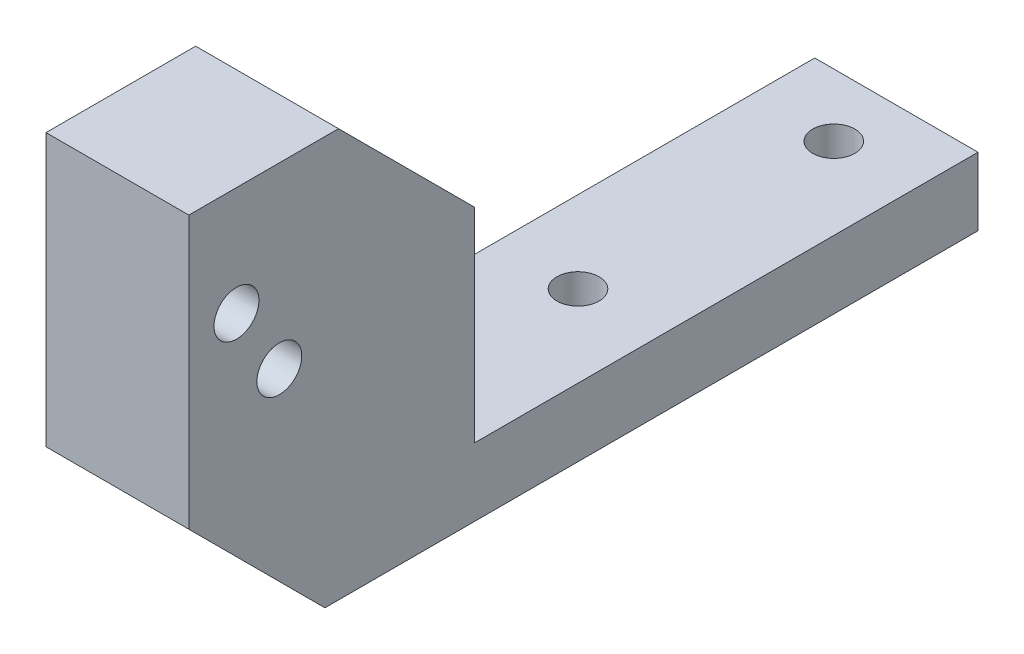
ISO-10303-21;
HEADER;
FILE_DESCRIPTION(('STEP AP214'),'2;1');
FILE_NAME('part.step','',(''),(''),'','','');
FILE_SCHEMA(('AUTOMOTIVE_DESIGN { 1 0 10303 214 1 1 1 1 }'));
ENDSEC;
DATA;
#1=APPLICATION_CONTEXT('core data for automotive mechanical design processes');
#2=APPLICATION_PROTOCOL_DEFINITION('international standard','automotive_design',2000,#1);
#3=PRODUCT_CONTEXT('',#1,'mechanical');
#4=PRODUCT('Part','Part','',(#3));
#5=PRODUCT_RELATED_PRODUCT_CATEGORY('part','',(#4));
#6=PRODUCT_DEFINITION_FORMATION('','',#4);
#7=PRODUCT_DEFINITION_CONTEXT('part definition',#1,'design');
#8=PRODUCT_DEFINITION('design','',#6,#7);
#9=PRODUCT_DEFINITION_SHAPE('','',#8);
#10=(LENGTH_UNIT() NAMED_UNIT(*) SI_UNIT(.MILLI.,.METRE.));
#11=(NAMED_UNIT(*) PLANE_ANGLE_UNIT() SI_UNIT($,.RADIAN.));
#12=(NAMED_UNIT(*) SI_UNIT($,.STERADIAN.) SOLID_ANGLE_UNIT());
#13=UNCERTAINTY_MEASURE_WITH_UNIT(LENGTH_MEASURE(1.E-05),#10,'distance_accuracy_value','');
#14=(GEOMETRIC_REPRESENTATION_CONTEXT(3) GLOBAL_UNCERTAINTY_ASSIGNED_CONTEXT((#13)) GLOBAL_UNIT_ASSIGNED_CONTEXT((#10,
#11,#12)) REPRESENTATION_CONTEXT('',''));
#15=CARTESIAN_POINT('',(0.,0.,0.));
#16=DIRECTION('',(0.,0.,1.));
#17=DIRECTION('',(1.,0.,0.));
#18=AXIS2_PLACEMENT_3D('',#15,#16,#17);
#19=CARTESIAN_POINT('',(0.,2.5,0.));
#20=DIRECTION('',(0.,-1.,0.));
#21=DIRECTION('',(0.,0.,-1.));
#22=AXIS2_PLACEMENT_3D('',#19,#20,#21);
#23=PLANE('',#22);
#24=CARTESIAN_POINT('',(0.,2.5,9.4));
#25=DIRECTION('',(0.,1.,0.));
#26=DIRECTION('',(0.,0.,-1.));
#27=AXIS2_PLACEMENT_3D('',#24,#25,#26);
#28=CIRCLE('',#27,1.55);
#29=CARTESIAN_POINT('',(0.,2.5,7.85));
#30=VERTEX_POINT('',#29);
#31=EDGE_CURVE('E168',#30,#30,#28,.T.);
#32=ORIENTED_EDGE('',*,*,#31,.F.);
#33=EDGE_LOOP('',(#32));
#34=FACE_BOUND('',#33,.T.);
#35=CARTESIAN_POINT('',(0.,2.5,-9.4));
#36=DIRECTION('',(0.,1.,0.));
#37=DIRECTION('',(0.,0.,1.));
#38=AXIS2_PLACEMENT_3D('',#35,#36,#37);
#39=CIRCLE('',#38,1.55);
#40=CARTESIAN_POINT('',(0.,2.5,-7.85));
#41=VERTEX_POINT('',#40);
#42=EDGE_CURVE('E176',#41,#41,#39,.T.);
#43=ORIENTED_EDGE('',*,*,#42,.F.);
#44=EDGE_LOOP('',(#43));
#45=FACE_BOUND('',#44,.T.);
#46=DIRECTION('',(0.,0.,1.));
#47=VECTOR('',#46,1.);
#48=CARTESIAN_POINT('',(-6.,2.5,14.));
#49=LINE('',#48,#47);
#50=CARTESIAN_POINT('',(-6.,2.5,-14.));
#51=VERTEX_POINT('',#50);
#52=CARTESIAN_POINT('',(-6.,2.5,39.));
#53=VERTEX_POINT('',#52);
#54=EDGE_CURVE('E191',#51,#53,#49,.T.);
#55=ORIENTED_EDGE('',*,*,#54,.T.);
#56=DIRECTION('',(-1.,0.,0.));
#57=VECTOR('',#56,1.);
#58=CARTESIAN_POINT('',(0.,2.5,39.));
#59=LINE('',#58,#57);
#60=CARTESIAN_POINT('',(-4.5,2.5,39.));
#61=VERTEX_POINT('',#60);
#62=EDGE_CURVE('E57',#53,#61,#59,.F.);
#63=ORIENTED_EDGE('',*,*,#62,.T.);
#64=DIRECTION('',(0.,0.,1.));
#65=VECTOR('',#64,1.);
#66=CARTESIAN_POINT('',(-4.5,2.5,44.));
#67=LINE('',#66,#65);
#68=CARTESIAN_POINT('',(-4.5,2.5,23.));
#69=VERTEX_POINT('',#68);
#70=EDGE_CURVE('E156',#69,#61,#67,.T.);
#71=ORIENTED_EDGE('',*,*,#70,.F.);
#72=DIRECTION('',(-1.,0.,0.));
#73=VECTOR('',#72,1.);
#74=CARTESIAN_POINT('',(6.,2.5,23.));
#75=LINE('',#74,#73);
#76=CARTESIAN_POINT('',(6.,2.5,23.));
#77=VERTEX_POINT('',#76);
#78=EDGE_CURVE('E152',#77,#69,#75,.T.);
#79=ORIENTED_EDGE('',*,*,#78,.F.);
#80=DIRECTION('',(0.,0.,-1.));
#81=VECTOR('',#80,1.);
#82=CARTESIAN_POINT('',(6.,2.5,14.));
#83=LINE('',#82,#81);
#84=CARTESIAN_POINT('',(6.,2.5,-14.));
#85=VERTEX_POINT('',#84);
#86=EDGE_CURVE('E184',#77,#85,#83,.T.);
#87=ORIENTED_EDGE('',*,*,#86,.T.);
#88=DIRECTION('',(-1.,0.,0.));
#89=VECTOR('',#88,1.);
#90=CARTESIAN_POINT('',(-6.,2.5,-14.));
#91=LINE('',#90,#89);
#92=EDGE_CURVE('E187',#85,#51,#91,.T.);
#93=ORIENTED_EDGE('',*,*,#92,.T.);
#94=EDGE_LOOP('',(#55,#63,#71,#79,#87,#93));
#95=FACE_BOUND('',#94,.T.);
#96=ADVANCED_FACE('F47',(#34,#45,#95),#23,.F.);
#97=CARTESIAN_POINT('',(0.,-2.5,0.));
#98=DIRECTION('',(0.,-1.,0.));
#99=DIRECTION('',(0.,0.,-1.));
#100=AXIS2_PLACEMENT_3D('',#97,#98,#99);
#101=PLANE('',#100);
#102=CARTESIAN_POINT('',(0.,-2.5,-9.4));
#103=DIRECTION('',(0.,1.,0.));
#104=DIRECTION('',(0.,0.,1.));
#105=AXIS2_PLACEMENT_3D('',#102,#103,#104);
#106=CIRCLE('',#105,1.55);
#107=CARTESIAN_POINT('',(0.,-2.5,-7.85));
#108=VERTEX_POINT('',#107);
#109=EDGE_CURVE('E172',#108,#108,#106,.T.);
#110=ORIENTED_EDGE('',*,*,#109,.T.);
#111=EDGE_LOOP('',(#110));
#112=FACE_BOUND('',#111,.T.);
#113=DIRECTION('',(0.,0.,-1.));
#114=VECTOR('',#113,1.);
#115=CARTESIAN_POINT('',(6.,-2.5,14.));
#116=LINE('',#115,#114);
#117=CARTESIAN_POINT('',(6.,-2.5,34.));
#118=VERTEX_POINT('',#117);
#119=CARTESIAN_POINT('',(6.,-2.5,-14.));
#120=VERTEX_POINT('',#119);
#121=EDGE_CURVE('E180',#118,#120,#116,.T.);
#122=ORIENTED_EDGE('',*,*,#121,.F.);
#123=DIRECTION('',(-1.,0.,0.));
#124=VECTOR('',#123,1.);
#125=CARTESIAN_POINT('',(0.,-2.5,34.));
#126=LINE('',#125,#124);
#127=CARTESIAN_POINT('',(-6.,-2.5,34.));
#128=VERTEX_POINT('',#127);
#129=EDGE_CURVE('E226',#118,#128,#126,.T.);
#130=ORIENTED_EDGE('',*,*,#129,.T.);
#131=DIRECTION('',(0.,0.,1.));
#132=VECTOR('',#131,1.);
#133=CARTESIAN_POINT('',(-6.,-2.5,14.));
#134=LINE('',#133,#132);
#135=CARTESIAN_POINT('',(-6.,-2.5,-14.));
#136=VERTEX_POINT('',#135);
#137=EDGE_CURVE('E188',#136,#128,#134,.T.);
#138=ORIENTED_EDGE('',*,*,#137,.F.);
#139=DIRECTION('',(-1.,0.,0.));
#140=VECTOR('',#139,1.);
#141=CARTESIAN_POINT('',(-6.,-2.5,-14.));
#142=LINE('',#141,#140);
#143=EDGE_CURVE('E197',#120,#136,#142,.T.);
#144=ORIENTED_EDGE('',*,*,#143,.F.);
#145=EDGE_LOOP('',(#122,#130,#138,#144));
#146=FACE_BOUND('',#145,.T.);
#147=CARTESIAN_POINT('',(0.,-2.5,9.4));
#148=DIRECTION('',(0.,1.,0.));
#149=DIRECTION('',(0.,0.,-1.));
#150=AXIS2_PLACEMENT_3D('',#147,#148,#149);
#151=CIRCLE('',#150,1.55);
#152=CARTESIAN_POINT('',(0.,-2.5,7.85));
#153=VERTEX_POINT('',#152);
#154=EDGE_CURVE('E167',#153,#153,#151,.T.);
#155=ORIENTED_EDGE('',*,*,#154,.T.);
#156=EDGE_LOOP('',(#155));
#157=FACE_BOUND('',#156,.T.);
#158=ADVANCED_FACE('F235',(#112,#146,#157),#101,.T.);
#159=CARTESIAN_POINT('',(6.,2.5,14.));
#160=DIRECTION('',(-1.,0.,0.));
#161=DIRECTION('',(0.,0.,1.));
#162=AXIS2_PLACEMENT_3D('',#159,#160,#161);
#163=PLANE('',#162);
#164=CARTESIAN_POINT('',(6.,19.5,40.5));
#165=DIRECTION('',(-1.,0.,0.));
#166=DIRECTION('',(0.,0.,1.));
#167=AXIS2_PLACEMENT_3D('',#164,#165,#166);
#168=CIRCLE('',#167,1.65);
#169=CARTESIAN_POINT('',(6.,19.5,42.15));
#170=VERTEX_POINT('',#169);
#171=EDGE_CURVE('E157',#170,#170,#168,.T.);
#172=ORIENTED_EDGE('',*,*,#171,.T.);
#173=EDGE_LOOP('',(#172));
#174=FACE_BOUND('',#173,.T.);
#175=CARTESIAN_POINT('',(6.,14.3933866408352,37.35));
#176=DIRECTION('',(-1.,0.,0.));
#177=DIRECTION('',(0.,0.,1.));
#178=AXIS2_PLACEMENT_3D('',#175,#176,#177);
#179=CIRCLE('',#178,1.65);
#180=CARTESIAN_POINT('',(6.,14.3933866408352,39.));
#181=VERTEX_POINT('',#180);
#182=EDGE_CURVE('E250',#181,#181,#179,.T.);
#183=ORIENTED_EDGE('',*,*,#182,.T.);
#184=EDGE_LOOP('',(#183));
#185=FACE_BOUND('',#184,.T.);
#186=DIRECTION('',(0.,1.,0.));
#187=VECTOR('',#186,1.);
#188=CARTESIAN_POINT('',(6.,2.5,44.));
#189=LINE('',#188,#187);
#190=CARTESIAN_POINT('',(6.,7.5,44.));
#191=VERTEX_POINT('',#190);
#192=CARTESIAN_POINT('',(6.,27.5,44.));
#193=VERTEX_POINT('',#192);
#194=EDGE_CURVE('E147',#191,#193,#189,.T.);
#195=ORIENTED_EDGE('',*,*,#194,.F.);
#196=DIRECTION('',(0.,0.707106781186547,0.707106781186548));
#197=VECTOR('',#196,1.);
#198=CARTESIAN_POINT('',(6.,7.5,44.));
#199=LINE('',#198,#197);
#200=EDGE_CURVE('E223',#191,#118,#199,.F.);
#201=ORIENTED_EDGE('',*,*,#200,.T.);
#202=ORIENTED_EDGE('',*,*,#121,.T.);
#203=DIRECTION('',(0.,-1.,0.));
#204=VECTOR('',#203,1.);
#205=CARTESIAN_POINT('',(6.,2.5,-14.));
#206=LINE('',#205,#204);
#207=EDGE_CURVE('E205',#85,#120,#206,.T.);
#208=ORIENTED_EDGE('',*,*,#207,.F.);
#209=ORIENTED_EDGE('',*,*,#86,.F.);
#210=DIRECTION('',(0.,-1.,0.));
#211=VECTOR('',#210,1.);
#212=CARTESIAN_POINT('',(6.,27.5,23.));
#213=LINE('',#212,#211);
#214=CARTESIAN_POINT('',(6.,17.5,23.));
#215=VERTEX_POINT('',#214);
#216=EDGE_CURVE('E162',#215,#77,#213,.T.);
#217=ORIENTED_EDGE('',*,*,#216,.F.);
#218=DIRECTION('',(0.,0.707106781186549,0.707106781186546));
#219=VECTOR('',#218,1.);
#220=CARTESIAN_POINT('',(6.,27.5,33.));
#221=LINE('',#220,#219);
#222=CARTESIAN_POINT('',(6.,27.5,33.));
#223=VERTEX_POINT('',#222);
#224=EDGE_CURVE('E217',#215,#223,#221,.T.);
#225=ORIENTED_EDGE('',*,*,#224,.T.);
#226=DIRECTION('',(0.,0.,-1.));
#227=VECTOR('',#226,1.);
#228=CARTESIAN_POINT('',(6.,27.5,44.));
#229=LINE('',#228,#227);
#230=EDGE_CURVE('E133',#193,#223,#229,.T.);
#231=ORIENTED_EDGE('',*,*,#230,.F.);
#232=EDGE_LOOP('',(#195,#201,#202,#208,#209,#217,#225,#231));
#233=FACE_BOUND('',#232,.T.);
#234=ADVANCED_FACE('F242',(#174,#185,#233),#163,.F.);
#235=CARTESIAN_POINT('',(-6.,2.5,-14.));
#236=DIRECTION('',(0.,0.,1.));
#237=DIRECTION('',(1.,0.,0.));
#238=AXIS2_PLACEMENT_3D('',#235,#236,#237);
#239=PLANE('',#238);
#240=ORIENTED_EDGE('',*,*,#143,.T.);
#241=DIRECTION('',(0.,-1.,0.));
#242=VECTOR('',#241,1.);
#243=CARTESIAN_POINT('',(-6.,2.5,-14.));
#244=LINE('',#243,#242);
#245=EDGE_CURVE('E194',#51,#136,#244,.T.);
#246=ORIENTED_EDGE('',*,*,#245,.F.);
#247=ORIENTED_EDGE('',*,*,#92,.F.);
#248=ORIENTED_EDGE('',*,*,#207,.T.);
#249=EDGE_LOOP('',(#240,#246,#247,#248));
#250=FACE_BOUND('',#249,.T.);
#251=ADVANCED_FACE('F280',(#250),#239,.F.);
#252=CARTESIAN_POINT('',(-6.,2.5,14.));
#253=DIRECTION('',(1.,0.,0.));
#254=DIRECTION('',(0.,0.,-1.));
#255=AXIS2_PLACEMENT_3D('',#252,#253,#254);
#256=PLANE('',#255);
#257=ORIENTED_EDGE('',*,*,#137,.T.);
#258=DIRECTION('',(0.,-0.707106781186547,-0.707106781186548));
#259=VECTOR('',#258,1.);
#260=CARTESIAN_POINT('',(-6.,7.5,44.));
#261=LINE('',#260,#259);
#262=EDGE_CURVE('E71',#128,#53,#261,.F.);
#263=ORIENTED_EDGE('',*,*,#262,.T.);
#264=ORIENTED_EDGE('',*,*,#54,.F.);
#265=ORIENTED_EDGE('',*,*,#245,.T.);
#266=EDGE_LOOP('',(#257,#263,#264,#265));
#267=FACE_BOUND('',#266,.T.);
#268=ADVANCED_FACE('F239',(#267),#256,.F.);
#269=CARTESIAN_POINT('',(0.,2.5,-9.4));
#270=DIRECTION('',(0.,-1.,0.));
#271=DIRECTION('',(0.,0.,-1.));
#272=AXIS2_PLACEMENT_3D('',#269,#270,#271);
#273=CYLINDRICAL_SURFACE('',#272,1.55);
#274=ORIENTED_EDGE('',*,*,#42,.T.);
#275=EDGE_LOOP('',(#274));
#276=FACE_BOUND('',#275,.T.);
#277=ORIENTED_EDGE('',*,*,#109,.F.);
#278=EDGE_LOOP('',(#277));
#279=FACE_BOUND('',#278,.T.);
#280=ADVANCED_FACE('F301',(#276,#279),#273,.F.);
#281=CARTESIAN_POINT('',(0.,2.5,9.4));
#282=DIRECTION('',(0.,-1.,0.));
#283=DIRECTION('',(0.,0.,-1.));
#284=AXIS2_PLACEMENT_3D('',#281,#282,#283);
#285=CYLINDRICAL_SURFACE('',#284,1.55);
#286=ORIENTED_EDGE('',*,*,#31,.T.);
#287=EDGE_LOOP('',(#286));
#288=FACE_BOUND('',#287,.T.);
#289=ORIENTED_EDGE('',*,*,#154,.F.);
#290=EDGE_LOOP('',(#289));
#291=FACE_BOUND('',#290,.T.);
#292=ADVANCED_FACE('F308',(#288,#291),#285,.F.);
#293=CARTESIAN_POINT('',(0.,0.,44.));
#294=DIRECTION('',(0.,0.,1.));
#295=DIRECTION('',(1.,0.,0.));
#296=AXIS2_PLACEMENT_3D('',#293,#294,#295);
#297=PLANE('',#296);
#298=DIRECTION('',(0.,-1.,0.));
#299=VECTOR('',#298,1.);
#300=CARTESIAN_POINT('',(-4.5,27.5,44.));
#301=LINE('',#300,#299);
#302=CARTESIAN_POINT('',(-4.5,27.5,44.));
#303=VERTEX_POINT('',#302);
#304=CARTESIAN_POINT('',(-4.5,7.5,44.));
#305=VERTEX_POINT('',#304);
#306=EDGE_CURVE('E136',#303,#305,#301,.T.);
#307=ORIENTED_EDGE('',*,*,#306,.T.);
#308=DIRECTION('',(1.,0.,0.));
#309=VECTOR('',#308,1.);
#310=CARTESIAN_POINT('',(0.,7.5,44.));
#311=LINE('',#310,#309);
#312=EDGE_CURVE('E220',#305,#191,#311,.T.);
#313=ORIENTED_EDGE('',*,*,#312,.T.);
#314=ORIENTED_EDGE('',*,*,#194,.T.);
#315=DIRECTION('',(1.,0.,0.));
#316=VECTOR('',#315,1.);
#317=CARTESIAN_POINT('',(6.,27.5,44.));
#318=LINE('',#317,#316);
#319=EDGE_CURVE('E127',#303,#193,#318,.T.);
#320=ORIENTED_EDGE('',*,*,#319,.F.);
#321=EDGE_LOOP('',(#307,#313,#314,#320));
#322=FACE_BOUND('',#321,.T.);
#323=ADVANCED_FACE('F145',(#322),#297,.T.);
#324=CARTESIAN_POINT('',(6.,27.5,23.));
#325=DIRECTION('',(0.,0.,1.));
#326=DIRECTION('',(1.,0.,0.));
#327=AXIS2_PLACEMENT_3D('',#324,#325,#326);
#328=PLANE('',#327);
#329=DIRECTION('',(0.,-1.,0.));
#330=VECTOR('',#329,1.);
#331=CARTESIAN_POINT('',(-4.5,27.5,23.));
#332=LINE('',#331,#330);
#333=CARTESIAN_POINT('',(-4.5,17.5,23.));
#334=VERTEX_POINT('',#333);
#335=EDGE_CURVE('E143',#334,#69,#332,.T.);
#336=ORIENTED_EDGE('',*,*,#335,.F.);
#337=DIRECTION('',(1.,0.,0.));
#338=VECTOR('',#337,1.);
#339=CARTESIAN_POINT('',(6.,17.5,23.));
#340=LINE('',#339,#338);
#341=EDGE_CURVE('E214',#334,#215,#340,.T.);
#342=ORIENTED_EDGE('',*,*,#341,.T.);
#343=ORIENTED_EDGE('',*,*,#216,.T.);
#344=ORIENTED_EDGE('',*,*,#78,.T.);
#345=EDGE_LOOP('',(#336,#342,#343,#344));
#346=FACE_BOUND('',#345,.T.);
#347=ADVANCED_FACE('F268',(#346),#328,.F.);
#348=CARTESIAN_POINT('',(-4.5,27.5,44.));
#349=DIRECTION('',(1.,0.,0.));
#350=DIRECTION('',(0.,0.,-1.));
#351=AXIS2_PLACEMENT_3D('',#348,#349,#350);
#352=PLANE('',#351);
#353=CARTESIAN_POINT('',(-4.5,19.5,40.5));
#354=DIRECTION('',(-1.,0.,0.));
#355=DIRECTION('',(0.,0.,1.));
#356=AXIS2_PLACEMENT_3D('',#353,#354,#355);
#357=CIRCLE('',#356,1.65);
#358=CARTESIAN_POINT('',(-4.5,19.5,42.15));
#359=VERTEX_POINT('',#358);
#360=EDGE_CURVE('E254',#359,#359,#357,.T.);
#361=ORIENTED_EDGE('',*,*,#360,.F.);
#362=EDGE_LOOP('',(#361));
#363=FACE_BOUND('',#362,.T.);
#364=CARTESIAN_POINT('',(-4.5,14.3933866408352,37.35));
#365=DIRECTION('',(-1.,0.,0.));
#366=DIRECTION('',(0.,0.,1.));
#367=AXIS2_PLACEMENT_3D('',#364,#365,#366);
#368=CIRCLE('',#367,1.65);
#369=CARTESIAN_POINT('',(-4.5,14.3933866408352,39.));
#370=VERTEX_POINT('',#369);
#371=EDGE_CURVE('E255',#370,#370,#368,.T.);
#372=ORIENTED_EDGE('',*,*,#371,.F.);
#373=EDGE_LOOP('',(#372));
#374=FACE_BOUND('',#373,.T.);
#375=ORIENTED_EDGE('',*,*,#70,.T.);
#376=DIRECTION('',(0.,-0.707106781186547,-0.707106781186548));
#377=VECTOR('',#376,1.);
#378=CARTESIAN_POINT('',(-4.5,7.5,44.));
#379=LINE('',#378,#377);
#380=EDGE_CURVE('E11',#61,#305,#379,.F.);
#381=ORIENTED_EDGE('',*,*,#380,.T.);
#382=ORIENTED_EDGE('',*,*,#306,.F.);
#383=DIRECTION('',(0.,0.,1.));
#384=VECTOR('',#383,1.);
#385=CARTESIAN_POINT('',(-4.5,27.5,44.));
#386=LINE('',#385,#384);
#387=CARTESIAN_POINT('',(-4.5,27.5,33.));
#388=VERTEX_POINT('',#387);
#389=EDGE_CURVE('E122',#388,#303,#386,.T.);
#390=ORIENTED_EDGE('',*,*,#389,.F.);
#391=DIRECTION('',(0.,-0.707106781186549,-0.707106781186546));
#392=VECTOR('',#391,1.);
#393=CARTESIAN_POINT('',(-4.5,27.5,33.));
#394=LINE('',#393,#392);
#395=EDGE_CURVE('E211',#388,#334,#394,.T.);
#396=ORIENTED_EDGE('',*,*,#395,.T.);
#397=ORIENTED_EDGE('',*,*,#335,.T.);
#398=EDGE_LOOP('',(#375,#381,#382,#390,#396,#397));
#399=FACE_BOUND('',#398,.T.);
#400=ADVANCED_FACE('F137',(#363,#374,#399),#352,.F.);
#401=CARTESIAN_POINT('',(0.,27.5,0.));
#402=DIRECTION('',(0.,1.,0.));
#403=DIRECTION('',(0.,0.,1.));
#404=AXIS2_PLACEMENT_3D('',#401,#402,#403);
#405=PLANE('',#404);
#406=ORIENTED_EDGE('',*,*,#230,.T.);
#407=DIRECTION('',(-1.,0.,0.));
#408=VECTOR('',#407,1.);
#409=CARTESIAN_POINT('',(-4.5,27.5,33.));
#410=LINE('',#409,#408);
#411=EDGE_CURVE('E130',#223,#388,#410,.T.);
#412=ORIENTED_EDGE('',*,*,#411,.T.);
#413=ORIENTED_EDGE('',*,*,#389,.T.);
#414=ORIENTED_EDGE('',*,*,#319,.T.);
#415=EDGE_LOOP('',(#406,#412,#413,#414));
#416=FACE_BOUND('',#415,.T.);
#417=ADVANCED_FACE('F125',(#416),#405,.T.);
#418=CARTESIAN_POINT('',(0.,27.5,33.));
#419=DIRECTION('',(0.,0.707106781186546,-0.707106781186549));
#420=DIRECTION('',(1.,0.,0.));
#421=AXIS2_PLACEMENT_3D('',#418,#419,#420);
#422=PLANE('',#421);
#423=ORIENTED_EDGE('',*,*,#224,.F.);
#424=ORIENTED_EDGE('',*,*,#341,.F.);
#425=ORIENTED_EDGE('',*,*,#395,.F.);
#426=ORIENTED_EDGE('',*,*,#411,.F.);
#427=EDGE_LOOP('',(#423,#424,#425,#426));
#428=FACE_BOUND('',#427,.T.);
#429=ADVANCED_FACE('F275',(#428),#422,.T.);
#430=CARTESIAN_POINT('',(20.5,14.3933866408352,37.35));
#431=DIRECTION('',(-1.,0.,0.));
#432=DIRECTION('',(0.,0.,1.));
#433=AXIS2_PLACEMENT_3D('',#430,#431,#432);
#434=CYLINDRICAL_SURFACE('',#433,1.65);
#435=ORIENTED_EDGE('',*,*,#371,.T.);
#436=EDGE_LOOP('',(#435));
#437=FACE_BOUND('',#436,.T.);
#438=ORIENTED_EDGE('',*,*,#182,.F.);
#439=EDGE_LOOP('',(#438));
#440=FACE_BOUND('',#439,.T.);
#441=ADVANCED_FACE('F272',(#437,#440),#434,.F.);
#442=CARTESIAN_POINT('',(20.5,19.5,40.5));
#443=DIRECTION('',(-1.,0.,0.));
#444=DIRECTION('',(0.,0.,1.));
#445=AXIS2_PLACEMENT_3D('',#442,#443,#444);
#446=CYLINDRICAL_SURFACE('',#445,1.65);
#447=ORIENTED_EDGE('',*,*,#360,.T.);
#448=EDGE_LOOP('',(#447));
#449=FACE_BOUND('',#448,.T.);
#450=ORIENTED_EDGE('',*,*,#171,.F.);
#451=EDGE_LOOP('',(#450));
#452=FACE_BOUND('',#451,.T.);
#453=ADVANCED_FACE('F263',(#449,#452),#446,.F.);
#454=CARTESIAN_POINT('',(0.,7.5,44.));
#455=DIRECTION('',(0.,0.707106781186548,-0.707106781186547));
#456=DIRECTION('',(1.,0.,0.));
#457=AXIS2_PLACEMENT_3D('',#454,#455,#456);
#458=PLANE('',#457);
#459=ORIENTED_EDGE('',*,*,#262,.F.);
#460=ORIENTED_EDGE('',*,*,#129,.F.);
#461=ORIENTED_EDGE('',*,*,#200,.F.);
#462=ORIENTED_EDGE('',*,*,#312,.F.);
#463=ORIENTED_EDGE('',*,*,#380,.F.);
#464=ORIENTED_EDGE('',*,*,#62,.F.);
#465=EDGE_LOOP('',(#459,#460,#461,#462,#463,#464));
#466=FACE_BOUND('',#465,.T.);
#467=ADVANCED_FACE('F50',(#466),#458,.F.);
#468=CLOSED_SHELL('',(#96,#158,#234,#251,#268,#280,#292,#323,#347,#400,#417,#429,#441,#453,#467));
#469=MANIFOLD_SOLID_BREP('B2',#468);
#470=ADVANCED_BREP_SHAPE_REPRESENTATION('',(#18,#469),#14);
#471=SHAPE_DEFINITION_REPRESENTATION(#9,#470);
ENDSEC;
END-ISO-10303-21;
